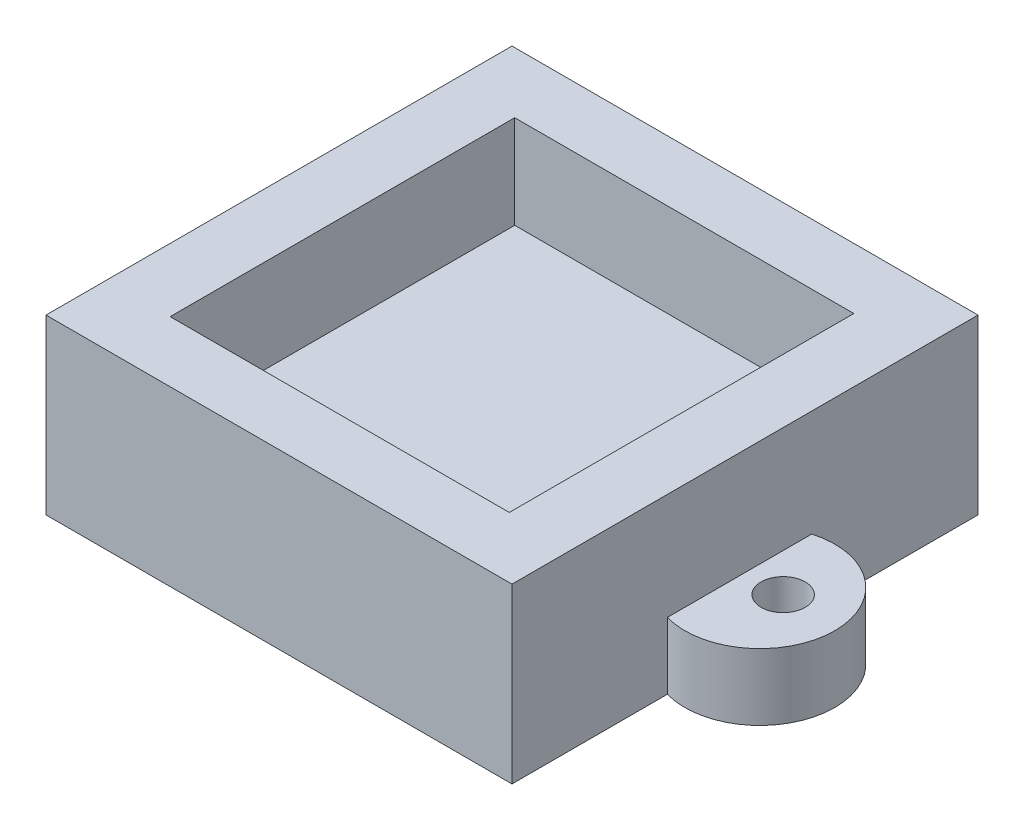
ISO-10303-21;
HEADER;
FILE_DESCRIPTION(('STEP AP214'),'2;1');
FILE_NAME('part.step','',(''),(''),'','','');
FILE_SCHEMA(('AUTOMOTIVE_DESIGN { 1 0 10303 214 1 1 1 1 }'));
ENDSEC;
DATA;
#1=APPLICATION_CONTEXT('core data for automotive mechanical design processes');
#2=APPLICATION_PROTOCOL_DEFINITION('international standard','automotive_design',2000,#1);
#3=PRODUCT_CONTEXT('',#1,'mechanical');
#4=PRODUCT('Part','Part','',(#3));
#5=PRODUCT_RELATED_PRODUCT_CATEGORY('part','',(#4));
#6=PRODUCT_DEFINITION_FORMATION('','',#4);
#7=PRODUCT_DEFINITION_CONTEXT('part definition',#1,'design');
#8=PRODUCT_DEFINITION('design','',#6,#7);
#9=PRODUCT_DEFINITION_SHAPE('','',#8);
#10=(LENGTH_UNIT() NAMED_UNIT(*) SI_UNIT(.MILLI.,.METRE.));
#11=(NAMED_UNIT(*) PLANE_ANGLE_UNIT() SI_UNIT($,.RADIAN.));
#12=(NAMED_UNIT(*) SI_UNIT($,.STERADIAN.) SOLID_ANGLE_UNIT());
#13=UNCERTAINTY_MEASURE_WITH_UNIT(LENGTH_MEASURE(1.E-05),#10,'distance_accuracy_value','');
#14=(GEOMETRIC_REPRESENTATION_CONTEXT(3) GLOBAL_UNCERTAINTY_ASSIGNED_CONTEXT((#13)) GLOBAL_UNIT_ASSIGNED_CONTEXT((#10,
#11,#12)) REPRESENTATION_CONTEXT('',''));
#15=CARTESIAN_POINT('',(0.,0.,0.));
#16=DIRECTION('',(0.,0.,1.));
#17=DIRECTION('',(1.,0.,0.));
#18=AXIS2_PLACEMENT_3D('',#15,#16,#17);
#19=CARTESIAN_POINT('',(0.,0.,0.));
#20=DIRECTION('',(0.,1.,0.));
#21=DIRECTION('',(0.,0.,1.));
#22=AXIS2_PLACEMENT_3D('',#19,#20,#21);
#23=PLANE('',#22);
#24=DIRECTION('',(0.,0.,1.));
#25=VECTOR('',#24,1.);
#26=CARTESIAN_POINT('',(-17.5,0.,17.5));
#27=LINE('',#26,#25);
#28=CARTESIAN_POINT('',(-17.5,0.,-17.5));
#29=VERTEX_POINT('',#28);
#30=CARTESIAN_POINT('',(-17.5,0.,-5.01562293263304));
#31=VERTEX_POINT('',#30);
#32=EDGE_CURVE('E214',#29,#31,#27,.T.);
#33=ORIENTED_EDGE('',*,*,#32,.F.);
#34=DIRECTION('',(-1.,0.,0.));
#35=VECTOR('',#34,1.);
#36=CARTESIAN_POINT('',(17.5,0.,-17.5));
#37=LINE('',#36,#35);
#38=CARTESIAN_POINT('',(17.5,0.,-17.5));
#39=VERTEX_POINT('',#38);
#40=EDGE_CURVE('E135',#39,#29,#37,.T.);
#41=ORIENTED_EDGE('',*,*,#40,.F.);
#42=DIRECTION('',(0.,0.,-1.));
#43=VECTOR('',#42,1.);
#44=CARTESIAN_POINT('',(17.5,0.,17.5));
#45=LINE('',#44,#43);
#46=CARTESIAN_POINT('',(17.5,0.,-5.01562293263306));
#47=VERTEX_POINT('',#46);
#48=EDGE_CURVE('E129',#47,#39,#45,.T.);
#49=ORIENTED_EDGE('',*,*,#48,.F.);
#50=CARTESIAN_POINT('',(19.0195589060442,0.,0.408796853443496));
#51=DIRECTION('',(0.,-1.,0.));
#52=DIRECTION('',(0.,0.,-1.));
#53=AXIS2_PLACEMENT_3D('',#50,#51,#52);
#54=CIRCLE('',#53,5.63323967930685);
#55=CARTESIAN_POINT('',(17.5,0.,5.83321663952005));
#56=VERTEX_POINT('',#55);
#57=EDGE_CURVE('E134',#56,#47,#54,.F.);
#58=ORIENTED_EDGE('',*,*,#57,.F.);
#59=CARTESIAN_POINT('',(17.5,0.,17.5));
#60=VERTEX_POINT('',#59);
#61=EDGE_CURVE('E138',#60,#56,#45,.T.);
#62=ORIENTED_EDGE('',*,*,#61,.F.);
#63=DIRECTION('',(1.,0.,0.));
#64=VECTOR('',#63,1.);
#65=CARTESIAN_POINT('',(17.5,0.,17.5));
#66=LINE('',#65,#64);
#67=CARTESIAN_POINT('',(-17.5,0.,17.5));
#68=VERTEX_POINT('',#67);
#69=EDGE_CURVE('E139',#68,#60,#66,.T.);
#70=ORIENTED_EDGE('',*,*,#69,.F.);
#71=CARTESIAN_POINT('',(-17.5,0.,5.83321663952006));
#72=VERTEX_POINT('',#71);
#73=EDGE_CURVE('E197',#72,#68,#27,.T.);
#74=ORIENTED_EDGE('',*,*,#73,.F.);
#75=CARTESIAN_POINT('',(-19.0195589060442,0.,0.40879685344351));
#76=DIRECTION('',(0.,-1.,0.));
#77=DIRECTION('',(0.,0.,-1.));
#78=AXIS2_PLACEMENT_3D('',#75,#76,#77);
#79=CIRCLE('',#78,5.63323967930685);
#80=EDGE_CURVE('E146',#72,#31,#79,.T.);
#81=ORIENTED_EDGE('',*,*,#80,.T.);
#82=EDGE_LOOP('',(#33,#41,#49,#58,#62,#70,#74,#81));
#83=FACE_BOUND('',#82,.T.);
#84=CARTESIAN_POINT('',(20.3673992705389,0.,0.));
#85=DIRECTION('',(0.,-1.,0.));
#86=DIRECTION('',(0.,0.,-1.));
#87=AXIS2_PLACEMENT_3D('',#84,#85,#86);
#88=CIRCLE('',#87,1.6591407463564);
#89=CARTESIAN_POINT('',(20.3673992705389,0.,-1.65914074635641));
#90=VERTEX_POINT('',#89);
#91=EDGE_CURVE('E228',#90,#90,#88,.F.);
#92=ORIENTED_EDGE('',*,*,#91,.T.);
#93=EDGE_LOOP('',(#92));
#94=FACE_BOUND('',#93,.T.);
#95=CARTESIAN_POINT('',(-20.3673992705389,0.,0.));
#96=DIRECTION('',(0.,-1.,0.));
#97=DIRECTION('',(0.,0.,-1.));
#98=AXIS2_PLACEMENT_3D('',#95,#96,#97);
#99=CIRCLE('',#98,1.6591407463564);
#100=CARTESIAN_POINT('',(-20.3673992705389,0.,-1.6591407463564));
#101=VERTEX_POINT('',#100);
#102=EDGE_CURVE('E224',#101,#101,#99,.T.);
#103=ORIENTED_EDGE('',*,*,#102,.F.);
#104=EDGE_LOOP('',(#103));
#105=FACE_BOUND('',#104,.T.);
#106=ADVANCED_FACE('F39',(#83,#94,#105),#23,.F.);
#107=CARTESIAN_POINT('',(17.5,13.,17.5));
#108=DIRECTION('',(-1.,0.,0.));
#109=DIRECTION('',(0.,0.,1.));
#110=AXIS2_PLACEMENT_3D('',#107,#108,#109);
#111=PLANE('',#110);
#112=DIRECTION('',(0.,-1.,0.));
#113=VECTOR('',#112,1.);
#114=CARTESIAN_POINT('',(17.5,5.,-5.01562293263306));
#115=LINE('',#114,#113);
#116=CARTESIAN_POINT('',(17.5,5.,-5.01562293263306));
#117=VERTEX_POINT('',#116);
#118=EDGE_CURVE('E142',#117,#47,#115,.T.);
#119=ORIENTED_EDGE('',*,*,#118,.T.);
#120=ORIENTED_EDGE('',*,*,#48,.T.);
#121=DIRECTION('',(0.,-1.,0.));
#122=VECTOR('',#121,1.);
#123=CARTESIAN_POINT('',(17.5,13.,-17.5));
#124=LINE('',#123,#122);
#125=CARTESIAN_POINT('',(17.5,13.,-17.5));
#126=VERTEX_POINT('',#125);
#127=EDGE_CURVE('E220',#126,#39,#124,.T.);
#128=ORIENTED_EDGE('',*,*,#127,.F.);
#129=DIRECTION('',(0.,0.,-1.));
#130=VECTOR('',#129,1.);
#131=CARTESIAN_POINT('',(17.5,13.,17.5));
#132=LINE('',#131,#130);
#133=CARTESIAN_POINT('',(17.5,13.,17.5));
#134=VERTEX_POINT('',#133);
#135=EDGE_CURVE('E209',#134,#126,#132,.T.);
#136=ORIENTED_EDGE('',*,*,#135,.F.);
#137=DIRECTION('',(0.,-1.,0.));
#138=VECTOR('',#137,1.);
#139=CARTESIAN_POINT('',(17.5,13.,17.5));
#140=LINE('',#139,#138);
#141=EDGE_CURVE('E48',#134,#60,#140,.T.);
#142=ORIENTED_EDGE('',*,*,#141,.T.);
#143=ORIENTED_EDGE('',*,*,#61,.T.);
#144=DIRECTION('',(0.,-1.,0.));
#145=VECTOR('',#144,1.);
#146=CARTESIAN_POINT('',(17.5,5.,5.83321663952005));
#147=LINE('',#146,#145);
#148=CARTESIAN_POINT('',(17.5,5.,5.83321663952005));
#149=VERTEX_POINT('',#148);
#150=EDGE_CURVE('E56',#149,#56,#147,.T.);
#151=ORIENTED_EDGE('',*,*,#150,.F.);
#152=DIRECTION('',(0.,0.,1.));
#153=VECTOR('',#152,1.);
#154=CARTESIAN_POINT('',(17.5,5.,0.));
#155=LINE('',#154,#153);
#156=EDGE_CURVE('E60',#117,#149,#155,.T.);
#157=ORIENTED_EDGE('',*,*,#156,.F.);
#158=EDGE_LOOP('',(#119,#120,#128,#136,#142,#143,#151,#157));
#159=FACE_BOUND('',#158,.T.);
#160=ADVANCED_FACE('F143',(#159),#111,.F.);
#161=CARTESIAN_POINT('',(-17.5,13.,17.5));
#162=DIRECTION('',(1.,0.,0.));
#163=DIRECTION('',(0.,0.,-1.));
#164=AXIS2_PLACEMENT_3D('',#161,#162,#163);
#165=PLANE('',#164);
#166=DIRECTION('',(0.,0.,-1.));
#167=VECTOR('',#166,1.);
#168=CARTESIAN_POINT('',(-17.5,5.,0.));
#169=LINE('',#168,#167);
#170=CARTESIAN_POINT('',(-17.5,5.,5.83321663952006));
#171=VERTEX_POINT('',#170);
#172=CARTESIAN_POINT('',(-17.5,5.,-5.01562293263304));
#173=VERTEX_POINT('',#172);
#174=EDGE_CURVE('E157',#171,#173,#169,.T.);
#175=ORIENTED_EDGE('',*,*,#174,.F.);
#176=DIRECTION('',(0.,-1.,0.));
#177=VECTOR('',#176,1.);
#178=CARTESIAN_POINT('',(-17.5,5.,5.83321663952006));
#179=LINE('',#178,#177);
#180=EDGE_CURVE('E163',#171,#72,#179,.T.);
#181=ORIENTED_EDGE('',*,*,#180,.T.);
#182=ORIENTED_EDGE('',*,*,#73,.T.);
#183=DIRECTION('',(0.,-1.,0.));
#184=VECTOR('',#183,1.);
#185=CARTESIAN_POINT('',(-17.5,13.,17.5));
#186=LINE('',#185,#184);
#187=CARTESIAN_POINT('',(-17.5,13.,17.5));
#188=VERTEX_POINT('',#187);
#189=EDGE_CURVE('E11',#188,#68,#186,.T.);
#190=ORIENTED_EDGE('',*,*,#189,.F.);
#191=DIRECTION('',(0.,0.,1.));
#192=VECTOR('',#191,1.);
#193=CARTESIAN_POINT('',(-17.5,13.,17.5));
#194=LINE('',#193,#192);
#195=CARTESIAN_POINT('',(-17.5,13.,-17.5));
#196=VERTEX_POINT('',#195);
#197=EDGE_CURVE('E204',#196,#188,#194,.T.);
#198=ORIENTED_EDGE('',*,*,#197,.F.);
#199=DIRECTION('',(0.,-1.,0.));
#200=VECTOR('',#199,1.);
#201=CARTESIAN_POINT('',(-17.5,13.,-17.5));
#202=LINE('',#201,#200);
#203=EDGE_CURVE('E213',#196,#29,#202,.T.);
#204=ORIENTED_EDGE('',*,*,#203,.T.);
#205=ORIENTED_EDGE('',*,*,#32,.T.);
#206=DIRECTION('',(0.,-1.,0.));
#207=VECTOR('',#206,1.);
#208=CARTESIAN_POINT('',(-17.5,5.,-5.01562293263304));
#209=LINE('',#208,#207);
#210=EDGE_CURVE('E166',#173,#31,#209,.T.);
#211=ORIENTED_EDGE('',*,*,#210,.F.);
#212=EDGE_LOOP('',(#175,#181,#182,#190,#198,#204,#205,#211));
#213=FACE_BOUND('',#212,.T.);
#214=ADVANCED_FACE('F41',(#213),#165,.F.);
#215=CARTESIAN_POINT('',(17.5,13.,17.5));
#216=DIRECTION('',(0.,0.,-1.));
#217=DIRECTION('',(-1.,0.,0.));
#218=AXIS2_PLACEMENT_3D('',#215,#216,#217);
#219=PLANE('',#218);
#220=ORIENTED_EDGE('',*,*,#69,.T.);
#221=ORIENTED_EDGE('',*,*,#141,.F.);
#222=DIRECTION('',(1.,0.,0.));
#223=VECTOR('',#222,1.);
#224=CARTESIAN_POINT('',(17.5,13.,17.5));
#225=LINE('',#224,#223);
#226=EDGE_CURVE('E207',#188,#134,#225,.T.);
#227=ORIENTED_EDGE('',*,*,#226,.F.);
#228=ORIENTED_EDGE('',*,*,#189,.T.);
#229=EDGE_LOOP('',(#220,#221,#227,#228));
#230=FACE_BOUND('',#229,.T.);
#231=ADVANCED_FACE('F261',(#230),#219,.F.);
#232=CARTESIAN_POINT('',(17.5,13.,-17.5));
#233=DIRECTION('',(0.,0.,1.));
#234=DIRECTION('',(1.,0.,0.));
#235=AXIS2_PLACEMENT_3D('',#232,#233,#234);
#236=PLANE('',#235);
#237=ORIENTED_EDGE('',*,*,#40,.T.);
#238=ORIENTED_EDGE('',*,*,#203,.F.);
#239=DIRECTION('',(-1.,0.,0.));
#240=VECTOR('',#239,1.);
#241=CARTESIAN_POINT('',(17.5,13.,-17.5));
#242=LINE('',#241,#240);
#243=EDGE_CURVE('E211',#126,#196,#242,.T.);
#244=ORIENTED_EDGE('',*,*,#243,.F.);
#245=ORIENTED_EDGE('',*,*,#127,.T.);
#246=EDGE_LOOP('',(#237,#238,#244,#245));
#247=FACE_BOUND('',#246,.T.);
#248=ADVANCED_FACE('F259',(#247),#236,.F.);
#249=CARTESIAN_POINT('',(0.,13.,0.));
#250=DIRECTION('',(0.,1.,0.));
#251=DIRECTION('',(0.,0.,1.));
#252=AXIS2_PLACEMENT_3D('',#249,#250,#251);
#253=PLANE('',#252);
#254=DIRECTION('',(0.,0.,1.));
#255=VECTOR('',#254,1.);
#256=CARTESIAN_POINT('',(-12.7355942803536,13.,12.9399927070754));
#257=LINE('',#256,#255);
#258=CARTESIAN_POINT('',(-12.7355942803536,13.,-12.9399927070754));
#259=VERTEX_POINT('',#258);
#260=CARTESIAN_POINT('',(-12.7355942803536,13.,12.9399927070754));
#261=VERTEX_POINT('',#260);
#262=EDGE_CURVE('E169',#259,#261,#257,.T.);
#263=ORIENTED_EDGE('',*,*,#262,.F.);
#264=DIRECTION('',(-1.,0.,0.));
#265=VECTOR('',#264,1.);
#266=CARTESIAN_POINT('',(12.7355942803536,13.,-12.9399927070754));
#267=LINE('',#266,#265);
#268=CARTESIAN_POINT('',(12.7355942803536,13.,-12.9399927070754));
#269=VERTEX_POINT('',#268);
#270=EDGE_CURVE('E176',#269,#259,#267,.T.);
#271=ORIENTED_EDGE('',*,*,#270,.F.);
#272=DIRECTION('',(0.,0.,-1.));
#273=VECTOR('',#272,1.);
#274=CARTESIAN_POINT('',(12.7355942803536,13.,12.9399927070754));
#275=LINE('',#274,#273);
#276=CARTESIAN_POINT('',(12.7355942803536,13.,12.9399927070754));
#277=VERTEX_POINT('',#276);
#278=EDGE_CURVE('E190',#277,#269,#275,.T.);
#279=ORIENTED_EDGE('',*,*,#278,.F.);
#280=DIRECTION('',(1.,0.,0.));
#281=VECTOR('',#280,1.);
#282=CARTESIAN_POINT('',(12.7355942803536,13.,12.9399927070754));
#283=LINE('',#282,#281);
#284=EDGE_CURVE('E187',#261,#277,#283,.T.);
#285=ORIENTED_EDGE('',*,*,#284,.F.);
#286=EDGE_LOOP('',(#263,#271,#279,#285));
#287=FACE_BOUND('',#286,.T.);
#288=ORIENTED_EDGE('',*,*,#197,.T.);
#289=ORIENTED_EDGE('',*,*,#226,.T.);
#290=ORIENTED_EDGE('',*,*,#135,.T.);
#291=ORIENTED_EDGE('',*,*,#243,.T.);
#292=EDGE_LOOP('',(#288,#289,#290,#291));
#293=FACE_BOUND('',#292,.T.);
#294=ADVANCED_FACE('F257',(#287,#293),#253,.T.);
#295=CARTESIAN_POINT('',(-12.7355942803536,6.,12.9399927070754));
#296=DIRECTION('',(-1.,0.,0.));
#297=DIRECTION('',(0.,0.,1.));
#298=AXIS2_PLACEMENT_3D('',#295,#296,#297);
#299=PLANE('',#298);
#300=ORIENTED_EDGE('',*,*,#262,.T.);
#301=DIRECTION('',(0.,1.,0.));
#302=VECTOR('',#301,1.);
#303=CARTESIAN_POINT('',(-12.7355942803536,6.,12.9399927070754));
#304=LINE('',#303,#302);
#305=CARTESIAN_POINT('',(-12.7355942803536,6.,12.9399927070754));
#306=VERTEX_POINT('',#305);
#307=EDGE_CURVE('E185',#306,#261,#304,.T.);
#308=ORIENTED_EDGE('',*,*,#307,.F.);
#309=DIRECTION('',(0.,0.,1.));
#310=VECTOR('',#309,1.);
#311=CARTESIAN_POINT('',(-12.7355942803536,6.,12.9399927070754));
#312=LINE('',#311,#310);
#313=CARTESIAN_POINT('',(-12.7355942803536,6.,-12.9399927070754));
#314=VERTEX_POINT('',#313);
#315=EDGE_CURVE('E172',#314,#306,#312,.T.);
#316=ORIENTED_EDGE('',*,*,#315,.F.);
#317=DIRECTION('',(0.,1.,0.));
#318=VECTOR('',#317,1.);
#319=CARTESIAN_POINT('',(-12.7355942803536,6.,-12.9399927070754));
#320=LINE('',#319,#318);
#321=EDGE_CURVE('E195',#314,#259,#320,.T.);
#322=ORIENTED_EDGE('',*,*,#321,.T.);
#323=EDGE_LOOP('',(#300,#308,#316,#322));
#324=FACE_BOUND('',#323,.T.);
#325=ADVANCED_FACE('F303',(#324),#299,.F.);
#326=CARTESIAN_POINT('',(12.7355942803536,6.,-12.9399927070754));
#327=DIRECTION('',(0.,0.,-1.));
#328=DIRECTION('',(-1.,0.,0.));
#329=AXIS2_PLACEMENT_3D('',#326,#327,#328);
#330=PLANE('',#329);
#331=ORIENTED_EDGE('',*,*,#270,.T.);
#332=ORIENTED_EDGE('',*,*,#321,.F.);
#333=DIRECTION('',(-1.,0.,0.));
#334=VECTOR('',#333,1.);
#335=CARTESIAN_POINT('',(12.7355942803536,6.,-12.9399927070754));
#336=LINE('',#335,#334);
#337=CARTESIAN_POINT('',(12.7355942803536,6.,-12.9399927070754));
#338=VERTEX_POINT('',#337);
#339=EDGE_CURVE('E182',#338,#314,#336,.T.);
#340=ORIENTED_EDGE('',*,*,#339,.F.);
#341=DIRECTION('',(0.,1.,0.));
#342=VECTOR('',#341,1.);
#343=CARTESIAN_POINT('',(12.7355942803536,6.,-12.9399927070754));
#344=LINE('',#343,#342);
#345=EDGE_CURVE('E198',#338,#269,#344,.T.);
#346=ORIENTED_EDGE('',*,*,#345,.T.);
#347=EDGE_LOOP('',(#331,#332,#340,#346));
#348=FACE_BOUND('',#347,.T.);
#349=ADVANCED_FACE('F299',(#348),#330,.F.);
#350=CARTESIAN_POINT('',(12.7355942803536,6.,12.9399927070754));
#351=DIRECTION('',(1.,0.,0.));
#352=DIRECTION('',(0.,0.,-1.));
#353=AXIS2_PLACEMENT_3D('',#350,#351,#352);
#354=PLANE('',#353);
#355=ORIENTED_EDGE('',*,*,#278,.T.);
#356=ORIENTED_EDGE('',*,*,#345,.F.);
#357=DIRECTION('',(0.,0.,-1.));
#358=VECTOR('',#357,1.);
#359=CARTESIAN_POINT('',(12.7355942803536,6.,12.9399927070754));
#360=LINE('',#359,#358);
#361=CARTESIAN_POINT('',(12.7355942803536,6.,12.9399927070754));
#362=VERTEX_POINT('',#361);
#363=EDGE_CURVE('E179',#362,#338,#360,.T.);
#364=ORIENTED_EDGE('',*,*,#363,.F.);
#365=DIRECTION('',(0.,1.,0.));
#366=VECTOR('',#365,1.);
#367=CARTESIAN_POINT('',(12.7355942803536,6.,12.9399927070754));
#368=LINE('',#367,#366);
#369=EDGE_CURVE('E200',#362,#277,#368,.T.);
#370=ORIENTED_EDGE('',*,*,#369,.T.);
#371=EDGE_LOOP('',(#355,#356,#364,#370));
#372=FACE_BOUND('',#371,.T.);
#373=ADVANCED_FACE('F302',(#372),#354,.F.);
#374=CARTESIAN_POINT('',(12.7355942803536,6.,12.9399927070754));
#375=DIRECTION('',(0.,0.,1.));
#376=DIRECTION('',(1.,0.,0.));
#377=AXIS2_PLACEMENT_3D('',#374,#375,#376);
#378=PLANE('',#377);
#379=ORIENTED_EDGE('',*,*,#284,.T.);
#380=ORIENTED_EDGE('',*,*,#369,.F.);
#381=DIRECTION('',(1.,0.,0.));
#382=VECTOR('',#381,1.);
#383=CARTESIAN_POINT('',(12.7355942803536,6.,12.9399927070754));
#384=LINE('',#383,#382);
#385=EDGE_CURVE('E175',#306,#362,#384,.T.);
#386=ORIENTED_EDGE('',*,*,#385,.F.);
#387=ORIENTED_EDGE('',*,*,#307,.T.);
#388=EDGE_LOOP('',(#379,#380,#386,#387));
#389=FACE_BOUND('',#388,.T.);
#390=ADVANCED_FACE('F297',(#389),#378,.F.);
#391=CARTESIAN_POINT('',(0.,6.,0.));
#392=DIRECTION('',(0.,1.,0.));
#393=DIRECTION('',(0.,0.,1.));
#394=AXIS2_PLACEMENT_3D('',#391,#392,#393);
#395=PLANE('',#394);
#396=ORIENTED_EDGE('',*,*,#315,.T.);
#397=ORIENTED_EDGE('',*,*,#385,.T.);
#398=ORIENTED_EDGE('',*,*,#363,.T.);
#399=ORIENTED_EDGE('',*,*,#339,.T.);
#400=EDGE_LOOP('',(#396,#397,#398,#399));
#401=FACE_BOUND('',#400,.T.);
#402=ADVANCED_FACE('F292',(#401),#395,.T.);
#403=CARTESIAN_POINT('',(-19.0195589060442,5.,0.40879685344351));
#404=DIRECTION('',(0.,-1.,0.));
#405=DIRECTION('',(0.,0.,-1.));
#406=AXIS2_PLACEMENT_3D('',#403,#404,#405);
#407=CYLINDRICAL_SURFACE('',#406,5.63323967930685);
#408=ORIENTED_EDGE('',*,*,#80,.F.);
#409=ORIENTED_EDGE('',*,*,#180,.F.);
#410=CARTESIAN_POINT('',(-19.0195589060442,5.,0.40879685344351));
#411=DIRECTION('',(0.,-1.,0.));
#412=DIRECTION('',(0.,0.,-1.));
#413=AXIS2_PLACEMENT_3D('',#410,#411,#412);
#414=CIRCLE('',#413,5.63323967930685);
#415=EDGE_CURVE('E160',#171,#173,#414,.T.);
#416=ORIENTED_EDGE('',*,*,#415,.T.);
#417=ORIENTED_EDGE('',*,*,#210,.T.);
#418=EDGE_LOOP('',(#408,#409,#416,#417));
#419=FACE_BOUND('',#418,.T.);
#420=ADVANCED_FACE('F280',(#419),#407,.T.);
#421=CARTESIAN_POINT('',(0.,5.,0.));
#422=DIRECTION('',(0.,-1.,0.));
#423=DIRECTION('',(0.,0.,-1.));
#424=AXIS2_PLACEMENT_3D('',#421,#422,#423);
#425=PLANE('',#424);
#426=CARTESIAN_POINT('',(-20.3673992705389,5.,0.));
#427=DIRECTION('',(0.,-1.,0.));
#428=DIRECTION('',(0.,0.,-1.));
#429=AXIS2_PLACEMENT_3D('',#426,#427,#428);
#430=CIRCLE('',#429,1.6591407463564);
#431=CARTESIAN_POINT('',(-20.3673992705389,5.,-1.6591407463564));
#432=VERTEX_POINT('',#431);
#433=EDGE_CURVE('E43',#432,#432,#430,.T.);
#434=ORIENTED_EDGE('',*,*,#433,.T.);
#435=EDGE_LOOP('',(#434));
#436=FACE_BOUND('',#435,.T.);
#437=ORIENTED_EDGE('',*,*,#174,.T.);
#438=ORIENTED_EDGE('',*,*,#415,.F.);
#439=EDGE_LOOP('',(#437,#438));
#440=FACE_BOUND('',#439,.T.);
#441=ADVANCED_FACE('F283',(#436,#440),#425,.F.);
#442=CARTESIAN_POINT('',(19.0195589060442,5.,0.408796853443496));
#443=DIRECTION('',(0.,-1.,0.));
#444=DIRECTION('',(0.,0.,-1.));
#445=AXIS2_PLACEMENT_3D('',#442,#443,#444);
#446=CYLINDRICAL_SURFACE('',#445,5.63323967930685);
#447=ORIENTED_EDGE('',*,*,#57,.T.);
#448=ORIENTED_EDGE('',*,*,#118,.F.);
#449=CARTESIAN_POINT('',(19.0195589060442,5.,0.408796853443496));
#450=DIRECTION('',(0.,-1.,0.));
#451=DIRECTION('',(0.,0.,-1.));
#452=AXIS2_PLACEMENT_3D('',#449,#450,#451);
#453=CIRCLE('',#452,5.63323967930685);
#454=EDGE_CURVE('E149',#149,#117,#453,.F.);
#455=ORIENTED_EDGE('',*,*,#454,.F.);
#456=ORIENTED_EDGE('',*,*,#150,.T.);
#457=EDGE_LOOP('',(#447,#448,#455,#456));
#458=FACE_BOUND('',#457,.T.);
#459=ADVANCED_FACE('F148',(#458),#446,.T.);
#460=CARTESIAN_POINT('',(0.,5.,0.));
#461=DIRECTION('',(0.,-1.,0.));
#462=DIRECTION('',(0.,0.,-1.));
#463=AXIS2_PLACEMENT_3D('',#460,#461,#462);
#464=PLANE('',#463);
#465=CARTESIAN_POINT('',(20.3673992705389,5.,0.));
#466=DIRECTION('',(0.,-1.,0.));
#467=DIRECTION('',(0.,0.,-1.));
#468=AXIS2_PLACEMENT_3D('',#465,#466,#467);
#469=CIRCLE('',#468,1.6591407463564);
#470=CARTESIAN_POINT('',(20.3673992705389,5.,-1.65914074635641));
#471=VERTEX_POINT('',#470);
#472=EDGE_CURVE('E153',#471,#471,#469,.F.);
#473=ORIENTED_EDGE('',*,*,#472,.F.);
#474=EDGE_LOOP('',(#473));
#475=FACE_BOUND('',#474,.T.);
#476=ORIENTED_EDGE('',*,*,#454,.T.);
#477=ORIENTED_EDGE('',*,*,#156,.T.);
#478=EDGE_LOOP('',(#476,#477));
#479=FACE_BOUND('',#478,.T.);
#480=ADVANCED_FACE('F240',(#475,#479),#464,.F.);
#481=CARTESIAN_POINT('',(20.3673992705389,13.,0.));
#482=DIRECTION('',(0.,-1.,0.));
#483=DIRECTION('',(0.,0.,-1.));
#484=AXIS2_PLACEMENT_3D('',#481,#482,#483);
#485=CYLINDRICAL_SURFACE('',#484,1.6591407463564);
#486=CARTESIAN_POINT('',(20.3673992705389,0.,-1.65914074635641));
#487=CARTESIAN_POINT('',(20.3673992705389,0.0520833333333334,-1.65914074635641));
#488=CARTESIAN_POINT('',(20.3673992705389,0.104166666666667,-1.65914074635641));
#489=CARTESIAN_POINT('',(20.3673992705389,0.208333333333334,-1.65914074635641));
#490=CARTESIAN_POINT('',(20.3673992705389,0.260416666666667,-1.65914074635641));
#491=CARTESIAN_POINT('',(20.3673992705389,0.364583333333334,-1.65914074635641));
#492=CARTESIAN_POINT('',(20.3673992705389,0.416666666666667,-1.65914074635641));
#493=CARTESIAN_POINT('',(20.3673992705389,0.520833333333334,-1.65914074635641));
#494=CARTESIAN_POINT('',(20.3673992705389,0.572916666666667,-1.65914074635641));
#495=CARTESIAN_POINT('',(20.3673992705389,0.677083333333334,-1.65914074635641));
#496=CARTESIAN_POINT('',(20.3673992705389,0.729166666666667,-1.65914074635641));
#497=CARTESIAN_POINT('',(20.3673992705389,0.833333333333334,-1.65914074635641));
#498=CARTESIAN_POINT('',(20.3673992705389,0.885416666666668,-1.65914074635641));
#499=CARTESIAN_POINT('',(20.3673992705389,0.989583333333334,-1.65914074635641));
#500=CARTESIAN_POINT('',(20.3673992705389,1.04166666666667,-1.65914074635641));
#501=CARTESIAN_POINT('',(20.3673992705389,1.14583333333333,-1.65914074635641));
#502=CARTESIAN_POINT('',(20.3673992705389,1.19791666666667,-1.65914074635641));
#503=CARTESIAN_POINT('',(20.3673992705389,1.30208333333333,-1.65914074635641));
#504=CARTESIAN_POINT('',(20.3673992705389,1.35416666666667,-1.65914074635641));
#505=CARTESIAN_POINT('',(20.3673992705389,1.45833333333333,-1.65914074635641));
#506=CARTESIAN_POINT('',(20.3673992705389,1.51041666666667,-1.65914074635641));
#507=CARTESIAN_POINT('',(20.3673992705389,1.61458333333333,-1.65914074635641));
#508=CARTESIAN_POINT('',(20.3673992705389,1.66666666666667,-1.65914074635641));
#509=CARTESIAN_POINT('',(20.3673992705389,1.77083333333333,-1.65914074635641));
#510=CARTESIAN_POINT('',(20.3673992705389,1.82291666666667,-1.65914074635641));
#511=CARTESIAN_POINT('',(20.3673992705389,1.92708333333333,-1.65914074635641));
#512=CARTESIAN_POINT('',(20.3673992705389,1.97916666666667,-1.65914074635641));
#513=CARTESIAN_POINT('',(20.3673992705389,2.08333333333333,-1.65914074635641));
#514=CARTESIAN_POINT('',(20.3673992705389,2.13541666666667,-1.65914074635641));
#515=CARTESIAN_POINT('',(20.3673992705389,2.23958333333333,-1.65914074635641));
#516=CARTESIAN_POINT('',(20.3673992705389,2.29166666666667,-1.65914074635641));
#517=CARTESIAN_POINT('',(20.3673992705389,2.39583333333333,-1.65914074635641));
#518=CARTESIAN_POINT('',(20.3673992705389,2.44791666666667,-1.65914074635641));
#519=CARTESIAN_POINT('',(20.3673992705389,2.55208333333333,-1.65914074635641));
#520=CARTESIAN_POINT('',(20.3673992705389,2.60416666666667,-1.65914074635641));
#521=CARTESIAN_POINT('',(20.3673992705389,2.70833333333333,-1.65914074635641));
#522=CARTESIAN_POINT('',(20.3673992705389,2.76041666666667,-1.65914074635641));
#523=CARTESIAN_POINT('',(20.3673992705389,2.86458333333333,-1.65914074635641));
#524=CARTESIAN_POINT('',(20.3673992705389,2.91666666666667,-1.65914074635641));
#525=CARTESIAN_POINT('',(20.3673992705389,3.02083333333333,-1.65914074635641));
#526=CARTESIAN_POINT('',(20.3673992705389,3.07291666666667,-1.65914074635641));
#527=CARTESIAN_POINT('',(20.3673992705389,3.17708333333333,-1.65914074635641));
#528=CARTESIAN_POINT('',(20.3673992705389,3.22916666666667,-1.65914074635641));
#529=CARTESIAN_POINT('',(20.3673992705389,3.33333333333333,-1.65914074635641));
#530=CARTESIAN_POINT('',(20.3673992705389,3.38541666666667,-1.65914074635641));
#531=CARTESIAN_POINT('',(20.3673992705389,3.48958333333333,-1.65914074635641));
#532=CARTESIAN_POINT('',(20.3673992705389,3.54166666666667,-1.65914074635641));
#533=CARTESIAN_POINT('',(20.3673992705389,3.64583333333333,-1.65914074635641));
#534=CARTESIAN_POINT('',(20.3673992705389,3.69791666666667,-1.65914074635641));
#535=CARTESIAN_POINT('',(20.3673992705389,3.80208333333333,-1.65914074635641));
#536=CARTESIAN_POINT('',(20.3673992705389,3.85416666666667,-1.65914074635641));
#537=CARTESIAN_POINT('',(20.3673992705389,3.95833333333333,-1.65914074635641));
#538=CARTESIAN_POINT('',(20.3673992705389,4.01041666666667,-1.65914074635641));
#539=CARTESIAN_POINT('',(20.3673992705389,4.11458333333333,-1.65914074635641));
#540=CARTESIAN_POINT('',(20.3673992705389,4.16666666666667,-1.65914074635641));
#541=CARTESIAN_POINT('',(20.3673992705389,4.27083333333333,-1.65914074635641));
#542=CARTESIAN_POINT('',(20.3673992705389,4.32291666666667,-1.65914074635641));
#543=CARTESIAN_POINT('',(20.3673992705389,4.42708333333333,-1.65914074635641));
#544=CARTESIAN_POINT('',(20.3673992705389,4.47916666666667,-1.65914074635641));
#545=CARTESIAN_POINT('',(20.3673992705389,4.58333333333333,-1.65914074635641));
#546=CARTESIAN_POINT('',(20.3673992705389,4.63541666666667,-1.65914074635641));
#547=CARTESIAN_POINT('',(20.3673992705389,4.73958333333333,-1.65914074635641));
#548=CARTESIAN_POINT('',(20.3673992705389,4.79166666666667,-1.65914074635641));
#549=CARTESIAN_POINT('',(20.3673992705389,4.89583333333333,-1.65914074635641));
#550=CARTESIAN_POINT('',(20.3673992705389,4.94791666666667,-1.65914074635641));
#551=CARTESIAN_POINT('',(20.3673992705389,5.,-1.65914074635641));
#552=B_SPLINE_CURVE_WITH_KNOTS('',3,(#486,#487,#488,#489,#490,#491,#492,#493,#494,#495,#496,
#497,#498,#499,#500,#501,#502,#503,#504,#505,#506,#507,#508,#509,#510,#511,#512,#513,#514,#515,
#516,#517,#518,#519,#520,#521,#522,#523,#524,#525,#526,#527,#528,#529,#530,#531,#532,#533,#534,
#535,#536,#537,#538,#539,#540,#541,#542,#543,#544,#545,#546,#547,#548,#549,#550,#551),
.UNSPECIFIED.,.F.,.F.,(4,2,2,2,2,2,2,2,2,2,2,2,2,2,2,2,2,2,2,2,2,2,2,2,2,2,2,2,2,2,2,2,4),(0.,
0.15625,0.3125,0.46875,0.625000000000001,0.781250000000001,0.937500000000001,1.09375,1.25,
1.40625,1.5625,1.71875,1.875,2.03125,2.1875,2.34375,2.5,2.65625,2.8125,2.96875,3.125,3.28125,
3.4375,3.59375,3.75,3.90625,4.0625,4.21875,4.375,4.53125,4.6875,4.84375,5.),.UNSPECIFIED.);
#553=EDGE_CURVE('BSEAM237',#90,#471,#552,.T.);
#554=ORIENTED_EDGE('',*,*,#91,.F.);
#555=ORIENTED_EDGE('',*,*,#472,.T.);
#556=ORIENTED_EDGE('',*,*,#553,.T.);
#557=ORIENTED_EDGE('',*,*,#553,.F.);
#558=EDGE_LOOP('',(#554,#556,#555,#557));
#559=FACE_BOUND('',#558,.T.);
#560=ADVANCED_FACE('F237',(#559),#485,.F.);
#561=CARTESIAN_POINT('',(-20.3673992705389,13.,0.));
#562=DIRECTION('',(0.,-1.,0.));
#563=DIRECTION('',(0.,0.,-1.));
#564=AXIS2_PLACEMENT_3D('',#561,#562,#563);
#565=CYLINDRICAL_SURFACE('',#564,1.6591407463564);
#566=CARTESIAN_POINT('',(-20.3673992705389,0.,-1.6591407463564));
#567=CARTESIAN_POINT('',(-20.3673992705389,0.0520833333333334,-1.6591407463564));
#568=CARTESIAN_POINT('',(-20.3673992705389,0.104166666666667,-1.6591407463564));
#569=CARTESIAN_POINT('',(-20.3673992705389,0.208333333333334,-1.6591407463564));
#570=CARTESIAN_POINT('',(-20.3673992705389,0.260416666666667,-1.6591407463564));
#571=CARTESIAN_POINT('',(-20.3673992705389,0.364583333333334,-1.6591407463564));
#572=CARTESIAN_POINT('',(-20.3673992705389,0.416666666666667,-1.6591407463564));
#573=CARTESIAN_POINT('',(-20.3673992705389,0.520833333333334,-1.6591407463564));
#574=CARTESIAN_POINT('',(-20.3673992705389,0.572916666666667,-1.6591407463564));
#575=CARTESIAN_POINT('',(-20.3673992705389,0.677083333333334,-1.6591407463564));
#576=CARTESIAN_POINT('',(-20.3673992705389,0.729166666666667,-1.6591407463564));
#577=CARTESIAN_POINT('',(-20.3673992705389,0.833333333333334,-1.6591407463564));
#578=CARTESIAN_POINT('',(-20.3673992705389,0.885416666666668,-1.6591407463564));
#579=CARTESIAN_POINT('',(-20.3673992705389,0.989583333333334,-1.6591407463564));
#580=CARTESIAN_POINT('',(-20.3673992705389,1.04166666666667,-1.6591407463564));
#581=CARTESIAN_POINT('',(-20.3673992705389,1.14583333333333,-1.6591407463564));
#582=CARTESIAN_POINT('',(-20.3673992705389,1.19791666666667,-1.6591407463564));
#583=CARTESIAN_POINT('',(-20.3673992705389,1.30208333333333,-1.6591407463564));
#584=CARTESIAN_POINT('',(-20.3673992705389,1.35416666666667,-1.6591407463564));
#585=CARTESIAN_POINT('',(-20.3673992705389,1.45833333333333,-1.6591407463564));
#586=CARTESIAN_POINT('',(-20.3673992705389,1.51041666666667,-1.6591407463564));
#587=CARTESIAN_POINT('',(-20.3673992705389,1.61458333333333,-1.6591407463564));
#588=CARTESIAN_POINT('',(-20.3673992705389,1.66666666666667,-1.6591407463564));
#589=CARTESIAN_POINT('',(-20.3673992705389,1.77083333333333,-1.6591407463564));
#590=CARTESIAN_POINT('',(-20.3673992705389,1.82291666666667,-1.6591407463564));
#591=CARTESIAN_POINT('',(-20.3673992705389,1.92708333333333,-1.6591407463564));
#592=CARTESIAN_POINT('',(-20.3673992705389,1.97916666666667,-1.6591407463564));
#593=CARTESIAN_POINT('',(-20.3673992705389,2.08333333333333,-1.6591407463564));
#594=CARTESIAN_POINT('',(-20.3673992705389,2.13541666666667,-1.6591407463564));
#595=CARTESIAN_POINT('',(-20.3673992705389,2.23958333333333,-1.6591407463564));
#596=CARTESIAN_POINT('',(-20.3673992705389,2.29166666666667,-1.6591407463564));
#597=CARTESIAN_POINT('',(-20.3673992705389,2.39583333333333,-1.6591407463564));
#598=CARTESIAN_POINT('',(-20.3673992705389,2.44791666666667,-1.6591407463564));
#599=CARTESIAN_POINT('',(-20.3673992705389,2.55208333333333,-1.6591407463564));
#600=CARTESIAN_POINT('',(-20.3673992705389,2.60416666666667,-1.6591407463564));
#601=CARTESIAN_POINT('',(-20.3673992705389,2.70833333333333,-1.6591407463564));
#602=CARTESIAN_POINT('',(-20.3673992705389,2.76041666666667,-1.6591407463564));
#603=CARTESIAN_POINT('',(-20.3673992705389,2.86458333333333,-1.6591407463564));
#604=CARTESIAN_POINT('',(-20.3673992705389,2.91666666666667,-1.6591407463564));
#605=CARTESIAN_POINT('',(-20.3673992705389,3.02083333333333,-1.6591407463564));
#606=CARTESIAN_POINT('',(-20.3673992705389,3.07291666666667,-1.6591407463564));
#607=CARTESIAN_POINT('',(-20.3673992705389,3.17708333333333,-1.6591407463564));
#608=CARTESIAN_POINT('',(-20.3673992705389,3.22916666666667,-1.6591407463564));
#609=CARTESIAN_POINT('',(-20.3673992705389,3.33333333333333,-1.6591407463564));
#610=CARTESIAN_POINT('',(-20.3673992705389,3.38541666666667,-1.6591407463564));
#611=CARTESIAN_POINT('',(-20.3673992705389,3.48958333333333,-1.6591407463564));
#612=CARTESIAN_POINT('',(-20.3673992705389,3.54166666666667,-1.6591407463564));
#613=CARTESIAN_POINT('',(-20.3673992705389,3.64583333333333,-1.6591407463564));
#614=CARTESIAN_POINT('',(-20.3673992705389,3.69791666666667,-1.6591407463564));
#615=CARTESIAN_POINT('',(-20.3673992705389,3.80208333333333,-1.6591407463564));
#616=CARTESIAN_POINT('',(-20.3673992705389,3.85416666666667,-1.6591407463564));
#617=CARTESIAN_POINT('',(-20.3673992705389,3.95833333333333,-1.6591407463564));
#618=CARTESIAN_POINT('',(-20.3673992705389,4.01041666666667,-1.6591407463564));
#619=CARTESIAN_POINT('',(-20.3673992705389,4.11458333333333,-1.6591407463564));
#620=CARTESIAN_POINT('',(-20.3673992705389,4.16666666666667,-1.6591407463564));
#621=CARTESIAN_POINT('',(-20.3673992705389,4.27083333333333,-1.6591407463564));
#622=CARTESIAN_POINT('',(-20.3673992705389,4.32291666666667,-1.6591407463564));
#623=CARTESIAN_POINT('',(-20.3673992705389,4.42708333333333,-1.6591407463564));
#624=CARTESIAN_POINT('',(-20.3673992705389,4.47916666666667,-1.6591407463564));
#625=CARTESIAN_POINT('',(-20.3673992705389,4.58333333333333,-1.6591407463564));
#626=CARTESIAN_POINT('',(-20.3673992705389,4.63541666666667,-1.6591407463564));
#627=CARTESIAN_POINT('',(-20.3673992705389,4.73958333333333,-1.6591407463564));
#628=CARTESIAN_POINT('',(-20.3673992705389,4.79166666666667,-1.6591407463564));
#629=CARTESIAN_POINT('',(-20.3673992705389,4.89583333333333,-1.6591407463564));
#630=CARTESIAN_POINT('',(-20.3673992705389,4.94791666666667,-1.6591407463564));
#631=CARTESIAN_POINT('',(-20.3673992705389,5.,-1.6591407463564));
#632=B_SPLINE_CURVE_WITH_KNOTS('',3,(#566,#567,#568,#569,#570,#571,#572,#573,#574,#575,#576,
#577,#578,#579,#580,#581,#582,#583,#584,#585,#586,#587,#588,#589,#590,#591,#592,#593,#594,#595,
#596,#597,#598,#599,#600,#601,#602,#603,#604,#605,#606,#607,#608,#609,#610,#611,#612,#613,#614,
#615,#616,#617,#618,#619,#620,#621,#622,#623,#624,#625,#626,#627,#628,#629,#630,#631),
.UNSPECIFIED.,.F.,.F.,(4,2,2,2,2,2,2,2,2,2,2,2,2,2,2,2,2,2,2,2,2,2,2,2,2,2,2,2,2,2,2,2,4),(0.,
0.15625,0.3125,0.46875,0.625000000000001,0.781250000000001,0.937500000000001,1.09375,1.25,
1.40625,1.5625,1.71875,1.875,2.03125,2.1875,2.34375,2.5,2.65625,2.8125,2.96875,3.125,3.28125,
3.4375,3.59375,3.75,3.90625,4.0625,4.21875,4.375,4.53125,4.6875,4.84375,5.),.UNSPECIFIED.);
#633=EDGE_CURVE('BSEAM239',#101,#432,#632,.T.);
#634=ORIENTED_EDGE('',*,*,#102,.T.);
#635=ORIENTED_EDGE('',*,*,#433,.F.);
#636=ORIENTED_EDGE('',*,*,#633,.T.);
#637=ORIENTED_EDGE('',*,*,#633,.F.);
#638=EDGE_LOOP('',(#634,#636,#635,#637));
#639=FACE_BOUND('',#638,.T.);
#640=ADVANCED_FACE('F239',(#639),#565,.F.);
#641=CLOSED_SHELL('',(#106,#160,#214,#231,#248,#294,#325,#349,#373,#390,#402,#420,#441,#459,
#480,#560,#640));
#642=MANIFOLD_SOLID_BREP('B2',#641);
#643=ADVANCED_BREP_SHAPE_REPRESENTATION('',(#18,#642),#14);
#644=SHAPE_DEFINITION_REPRESENTATION(#9,#643);
ENDSEC;
END-ISO-10303-21;
